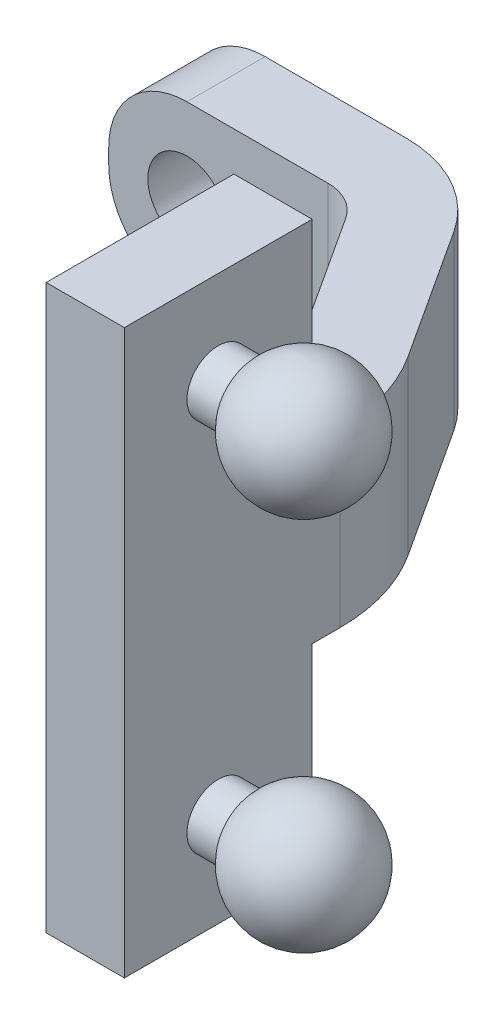
ISO-10303-21;
HEADER;
FILE_DESCRIPTION(('STEP AP214'),'2;1');
FILE_NAME('part.step','',(''),(''),'','','');
FILE_SCHEMA(('AUTOMOTIVE_DESIGN { 1 0 10303 214 1 1 1 1 }'));
ENDSEC;
DATA;
#1=APPLICATION_CONTEXT('core data for automotive mechanical design processes');
#2=APPLICATION_PROTOCOL_DEFINITION('international standard','automotive_design',2000,#1);
#3=PRODUCT_CONTEXT('',#1,'mechanical');
#4=PRODUCT('Part','Part','',(#3));
#5=PRODUCT_RELATED_PRODUCT_CATEGORY('part','',(#4));
#6=PRODUCT_DEFINITION_FORMATION('','',#4);
#7=PRODUCT_DEFINITION_CONTEXT('part definition',#1,'design');
#8=PRODUCT_DEFINITION('design','',#6,#7);
#9=PRODUCT_DEFINITION_SHAPE('','',#8);
#10=(LENGTH_UNIT() NAMED_UNIT(*) SI_UNIT(.MILLI.,.METRE.));
#11=(NAMED_UNIT(*) PLANE_ANGLE_UNIT() SI_UNIT($,.RADIAN.));
#12=(NAMED_UNIT(*) SI_UNIT($,.STERADIAN.) SOLID_ANGLE_UNIT());
#13=UNCERTAINTY_MEASURE_WITH_UNIT(LENGTH_MEASURE(1.E-05),#10,'distance_accuracy_value','');
#14=(GEOMETRIC_REPRESENTATION_CONTEXT(3) GLOBAL_UNCERTAINTY_ASSIGNED_CONTEXT((#13)) GLOBAL_UNIT_ASSIGNED_CONTEXT((#10,
#11,#12)) REPRESENTATION_CONTEXT('',''));
#15=CARTESIAN_POINT('',(0.,0.,0.));
#16=DIRECTION('',(0.,0.,1.));
#17=DIRECTION('',(1.,0.,0.));
#18=AXIS2_PLACEMENT_3D('',#15,#16,#17);
#19=CARTESIAN_POINT('',(0.,2.75,0.));
#20=DIRECTION('',(1.,0.,0.));
#21=DIRECTION('',(0.,0.,-1.));
#22=AXIS2_PLACEMENT_3D('',#19,#20,#21);
#23=PLANE('',#22);
#24=DIRECTION('',(0.,-1.,0.));
#25=VECTOR('',#24,1.);
#26=CARTESIAN_POINT('',(0.,2.75,0.));
#27=LINE('',#26,#25);
#28=CARTESIAN_POINT('',(0.,0.25,0.));
#29=VERTEX_POINT('',#28);
#30=CARTESIAN_POINT('',(0.,-0.25,0.));
#31=VERTEX_POINT('',#30);
#32=EDGE_CURVE('E245',#29,#31,#27,.T.);
#33=ORIENTED_EDGE('',*,*,#32,.T.);
#34=DIRECTION('',(0.,0.,1.));
#35=VECTOR('',#34,1.);
#36=CARTESIAN_POINT('',(0.,-0.25,2.5));
#37=LINE('',#36,#35);
#38=CARTESIAN_POINT('',(0.,-0.25,2.5));
#39=VERTEX_POINT('',#38);
#40=EDGE_CURVE('E296',#31,#39,#37,.T.);
#41=ORIENTED_EDGE('',*,*,#40,.T.);
#42=DIRECTION('',(0.,-1.,0.));
#43=VECTOR('',#42,1.);
#44=CARTESIAN_POINT('',(0.,2.75,2.5));
#45=LINE('',#44,#43);
#46=CARTESIAN_POINT('',(0.,0.25,2.5));
#47=VERTEX_POINT('',#46);
#48=EDGE_CURVE('E291',#47,#39,#45,.T.);
#49=ORIENTED_EDGE('',*,*,#48,.F.);
#50=DIRECTION('',(0.,0.,1.));
#51=VECTOR('',#50,1.);
#52=CARTESIAN_POINT('',(0.,0.25,0.));
#53=LINE('',#52,#51);
#54=EDGE_CURVE('E294',#47,#29,#53,.F.);
#55=ORIENTED_EDGE('',*,*,#54,.T.);
#56=EDGE_LOOP('',(#33,#41,#49,#55));
#57=FACE_BOUND('',#56,.T.);
#58=ADVANCED_FACE('F41',(#57),#23,.F.);
#59=CARTESIAN_POINT('',(0.,2.75,2.5));
#60=DIRECTION('',(0.,0.,-1.));
#61=DIRECTION('',(-1.,0.,0.));
#62=AXIS2_PLACEMENT_3D('',#59,#60,#61);
#63=PLANE('',#62);
#64=CARTESIAN_POINT('',(2.5,0.,2.5));
#65=DIRECTION('',(0.,0.,-1.));
#66=DIRECTION('',(-1.,0.,0.));
#67=AXIS2_PLACEMENT_3D('',#64,#65,#66);
#68=CIRCLE('',#67,1.25);
#69=CARTESIAN_POINT('',(1.25,0.,2.5));
#70=VERTEX_POINT('',#69);
#71=EDGE_CURVE('E220',#70,#70,#68,.T.);
#72=ORIENTED_EDGE('',*,*,#71,.T.);
#73=EDGE_LOOP('',(#72));
#74=FACE_BOUND('',#73,.T.);
#75=ORIENTED_EDGE('',*,*,#48,.T.);
#76=CARTESIAN_POINT('',(2.5,-0.25,2.5));
#77=DIRECTION('',(0.,0.,-1.));
#78=DIRECTION('',(-1.,0.,0.));
#79=AXIS2_PLACEMENT_3D('',#76,#77,#78);
#80=CIRCLE('',#79,2.5);
#81=CARTESIAN_POINT('',(2.5,-2.75,2.5));
#82=VERTEX_POINT('',#81);
#83=EDGE_CURVE('E301',#39,#82,#80,.F.);
#84=ORIENTED_EDGE('',*,*,#83,.T.);
#85=DIRECTION('',(1.,0.,0.));
#86=VECTOR('',#85,1.);
#87=CARTESIAN_POINT('',(0.,-2.75,2.5));
#88=LINE('',#87,#86);
#89=CARTESIAN_POINT('',(7.,-2.75,2.5));
#90=VERTEX_POINT('',#89);
#91=EDGE_CURVE('E223',#82,#90,#88,.T.);
#92=ORIENTED_EDGE('',*,*,#91,.T.);
#93=DIRECTION('',(0.,-1.,0.));
#94=VECTOR('',#93,1.);
#95=CARTESIAN_POINT('',(7.,2.75,2.5));
#96=LINE('',#95,#94);
#97=CARTESIAN_POINT('',(7.,2.75,2.5));
#98=VERTEX_POINT('',#97);
#99=EDGE_CURVE('E288',#98,#90,#96,.T.);
#100=ORIENTED_EDGE('',*,*,#99,.F.);
#101=DIRECTION('',(1.,0.,0.));
#102=VECTOR('',#101,1.);
#103=CARTESIAN_POINT('',(0.,2.75,2.5));
#104=LINE('',#103,#102);
#105=CARTESIAN_POINT('',(2.5,2.75,2.5));
#106=VERTEX_POINT('',#105);
#107=EDGE_CURVE('E224',#106,#98,#104,.T.);
#108=ORIENTED_EDGE('',*,*,#107,.F.);
#109=CARTESIAN_POINT('',(2.5,0.25,2.5));
#110=DIRECTION('',(0.,0.,-1.));
#111=DIRECTION('',(-1.,0.,0.));
#112=AXIS2_PLACEMENT_3D('',#109,#110,#111);
#113=CIRCLE('',#112,2.5);
#114=EDGE_CURVE('E299',#106,#47,#113,.F.);
#115=ORIENTED_EDGE('',*,*,#114,.T.);
#116=EDGE_LOOP('',(#75,#84,#92,#100,#108,#115));
#117=FACE_BOUND('',#116,.T.);
#118=ADVANCED_FACE('F384',(#74,#117),#63,.F.);
#119=CARTESIAN_POINT('',(7.,2.75,4.));
#120=DIRECTION('',(0.,-1.,0.));
#121=DIRECTION('',(0.,0.,-1.));
#122=AXIS2_PLACEMENT_3D('',#119,#120,#121);
#123=CYLINDRICAL_SURFACE('',#122,1.5);
#124=CARTESIAN_POINT('',(7.,-2.75,4.));
#125=DIRECTION('',(0.,-1.,0.));
#126=DIRECTION('',(0.,0.,-1.));
#127=AXIS2_PLACEMENT_3D('',#124,#125,#126);
#128=CIRCLE('',#127,1.5);
#129=CARTESIAN_POINT('',(8.25754577081105,-2.75,3.18233342106012));
#130=VERTEX_POINT('',#129);
#131=EDGE_CURVE('E247',#90,#130,#128,.T.);
#132=ORIENTED_EDGE('',*,*,#131,.T.);
#133=DIRECTION('',(0.,-1.,0.));
#134=VECTOR('',#133,1.);
#135=CARTESIAN_POINT('',(8.25754577081105,2.75,3.18233342106012));
#136=LINE('',#135,#134);
#137=CARTESIAN_POINT('',(8.25754577081105,2.75,3.18233342106012));
#138=VERTEX_POINT('',#137);
#139=EDGE_CURVE('E285',#138,#130,#136,.T.);
#140=ORIENTED_EDGE('',*,*,#139,.F.);
#141=CARTESIAN_POINT('',(7.,2.75,4.));
#142=DIRECTION('',(0.,-1.,0.));
#143=DIRECTION('',(0.,0.,-1.));
#144=AXIS2_PLACEMENT_3D('',#141,#142,#143);
#145=CIRCLE('',#144,1.5);
#146=EDGE_CURVE('E226',#98,#138,#145,.T.);
#147=ORIENTED_EDGE('',*,*,#146,.F.);
#148=ORIENTED_EDGE('',*,*,#99,.T.);
#149=EDGE_LOOP('',(#132,#140,#147,#148));
#150=FACE_BOUND('',#149,.T.);
#151=ADVANCED_FACE('F347',(#150),#123,.F.);
#152=CARTESIAN_POINT('',(8.25754577081105,2.75,3.18233342106012));
#153=DIRECTION('',(0.838363847207363,0.,-0.54511105262659));
#154=DIRECTION('',(-0.54511105262659,0.,-0.838363847207363));
#155=AXIS2_PLACEMENT_3D('',#152,#153,#154);
#156=PLANE('',#155);
#157=DIRECTION('',(0.54511105262659,0.,0.838363847207363));
#158=VECTOR('',#157,1.);
#159=CARTESIAN_POINT('',(8.25754577081105,-2.75,3.18233342106012));
#160=LINE('',#159,#158);
#161=CARTESIAN_POINT('',(10.9902966016318,-2.75,7.38521921643481));
#162=VERTEX_POINT('',#161);
#163=EDGE_CURVE('E249',#130,#162,#160,.T.);
#164=ORIENTED_EDGE('',*,*,#163,.T.);
#165=DIRECTION('',(0.,-1.,0.));
#166=VECTOR('',#165,1.);
#167=CARTESIAN_POINT('',(10.9902966016318,2.75,7.38521921643481));
#168=LINE('',#167,#166);
#169=CARTESIAN_POINT('',(10.9902966016318,2.75,7.38521921643481));
#170=VERTEX_POINT('',#169);
#171=EDGE_CURVE('E282',#170,#162,#168,.T.);
#172=ORIENTED_EDGE('',*,*,#171,.F.);
#173=DIRECTION('',(0.54511105262659,0.,0.838363847207363));
#174=VECTOR('',#173,1.);
#175=CARTESIAN_POINT('',(8.25754577081105,2.75,3.18233342106012));
#176=LINE('',#175,#174);
#177=EDGE_CURVE('E229',#138,#170,#176,.T.);
#178=ORIENTED_EDGE('',*,*,#177,.F.);
#179=ORIENTED_EDGE('',*,*,#139,.T.);
#180=EDGE_LOOP('',(#164,#172,#178,#179));
#181=FACE_BOUND('',#180,.T.);
#182=ADVANCED_FACE('F343',(#181),#156,.F.);
#183=CARTESIAN_POINT('',(8.34660028365028,2.75,9.10417225516659));
#184=DIRECTION('',(0.,-1.,0.));
#185=DIRECTION('',(0.,0.,-1.));
#186=AXIS2_PLACEMENT_3D('',#183,#184,#185);
#187=CYLINDRICAL_SURFACE('',#186,3.15339971634972);
#188=CARTESIAN_POINT('',(8.34660028365028,-2.75,9.10417225516659));
#189=DIRECTION('',(0.,-1.,0.));
#190=DIRECTION('',(0.,0.,1.));
#191=AXIS2_PLACEMENT_3D('',#188,#189,#190);
#192=CIRCLE('',#191,3.15339971634972);
#193=CARTESIAN_POINT('',(11.5,-2.75,9.10417225516659));
#194=VERTEX_POINT('',#193);
#195=EDGE_CURVE('E251',#162,#194,#192,.T.);
#196=ORIENTED_EDGE('',*,*,#195,.T.);
#197=DIRECTION('',(0.,-1.,0.));
#198=VECTOR('',#197,1.);
#199=CARTESIAN_POINT('',(11.5,2.75,9.10417225516659));
#200=LINE('',#199,#198);
#201=CARTESIAN_POINT('',(11.5,2.75,9.10417225516659));
#202=VERTEX_POINT('',#201);
#203=EDGE_CURVE('E179',#202,#194,#200,.T.);
#204=ORIENTED_EDGE('',*,*,#203,.F.);
#205=CARTESIAN_POINT('',(8.34660028365028,2.75,9.10417225516659));
#206=DIRECTION('',(0.,-1.,0.));
#207=DIRECTION('',(0.,0.,1.));
#208=AXIS2_PLACEMENT_3D('',#205,#206,#207);
#209=CIRCLE('',#208,3.15339971634972);
#210=EDGE_CURVE('E231',#170,#202,#209,.T.);
#211=ORIENTED_EDGE('',*,*,#210,.F.);
#212=ORIENTED_EDGE('',*,*,#171,.T.);
#213=EDGE_LOOP('',(#196,#204,#211,#212));
#214=FACE_BOUND('',#213,.T.);
#215=ADVANCED_FACE('F339',(#214),#187,.F.);
#216=CARTESIAN_POINT('',(11.5,2.75,9.10417225516659));
#217=DIRECTION('',(1.,0.,0.));
#218=DIRECTION('',(0.,0.,-1.));
#219=AXIS2_PLACEMENT_3D('',#216,#217,#218);
#220=PLANE('',#219);
#221=DIRECTION('',(0.,0.,1.));
#222=VECTOR('',#221,1.);
#223=CARTESIAN_POINT('',(11.5,-2.75,9.10417225516659));
#224=LINE('',#223,#222);
#225=CARTESIAN_POINT('',(11.5,-2.75,10.));
#226=VERTEX_POINT('',#225);
#227=EDGE_CURVE('E253',#194,#226,#224,.T.);
#228=ORIENTED_EDGE('',*,*,#227,.T.);
#229=DIRECTION('',(0.,-1.,0.));
#230=VECTOR('',#229,1.);
#231=CARTESIAN_POINT('',(11.5,8.99999999999999,10.));
#232=LINE('',#231,#230);
#233=CARTESIAN_POINT('',(11.5,-9.,10.));
#234=VERTEX_POINT('',#233);
#235=EDGE_CURVE('E193',#226,#234,#232,.T.);
#236=ORIENTED_EDGE('',*,*,#235,.T.);
#237=DIRECTION('',(0.,0.,1.));
#238=VECTOR('',#237,1.);
#239=CARTESIAN_POINT('',(11.5,-9.,10.));
#240=LINE('',#239,#238);
#241=CARTESIAN_POINT('',(11.5,-9.,16.));
#242=VERTEX_POINT('',#241);
#243=EDGE_CURVE('E175',#234,#242,#240,.T.);
#244=ORIENTED_EDGE('',*,*,#243,.T.);
#245=DIRECTION('',(0.,-1.,0.));
#246=VECTOR('',#245,1.);
#247=CARTESIAN_POINT('',(11.5,2.75,16.));
#248=LINE('',#247,#246);
#249=CARTESIAN_POINT('',(11.5,9.,16.));
#250=VERTEX_POINT('',#249);
#251=EDGE_CURVE('E167',#250,#242,#248,.T.);
#252=ORIENTED_EDGE('',*,*,#251,.F.);
#253=DIRECTION('',(0.,0.,-1.));
#254=VECTOR('',#253,1.);
#255=CARTESIAN_POINT('',(11.5,8.99999999999999,10.));
#256=LINE('',#255,#254);
#257=CARTESIAN_POINT('',(11.5,8.99999999999999,10.));
#258=VERTEX_POINT('',#257);
#259=EDGE_CURVE('E173',#250,#258,#256,.T.);
#260=ORIENTED_EDGE('',*,*,#259,.T.);
#261=CARTESIAN_POINT('',(11.5,2.75,10.));
#262=VERTEX_POINT('',#261);
#263=EDGE_CURVE('E196',#258,#262,#232,.T.);
#264=ORIENTED_EDGE('',*,*,#263,.T.);
#265=DIRECTION('',(0.,0.,1.));
#266=VECTOR('',#265,1.);
#267=CARTESIAN_POINT('',(11.5,2.75,9.10417225516659));
#268=LINE('',#267,#266);
#269=EDGE_CURVE('E56',#202,#262,#268,.T.);
#270=ORIENTED_EDGE('',*,*,#269,.F.);
#271=ORIENTED_EDGE('',*,*,#203,.T.);
#272=EDGE_LOOP('',(#228,#236,#244,#252,#260,#264,#270,#271));
#273=FACE_BOUND('',#272,.T.);
#274=ADVANCED_FACE('F170',(#273),#220,.F.);
#275=CARTESIAN_POINT('',(11.5,2.75,16.));
#276=DIRECTION('',(0.,0.,-1.));
#277=DIRECTION('',(-1.,0.,0.));
#278=AXIS2_PLACEMENT_3D('',#275,#276,#277);
#279=PLANE('',#278);
#280=ORIENTED_EDGE('',*,*,#251,.T.);
#281=DIRECTION('',(-1.,0.,0.));
#282=VECTOR('',#281,1.);
#283=CARTESIAN_POINT('',(32.9736659610103,-9.,16.));
#284=LINE('',#283,#282);
#285=CARTESIAN_POINT('',(14.,-9.,16.));
#286=VERTEX_POINT('',#285);
#287=EDGE_CURVE('E206',#286,#242,#284,.T.);
#288=ORIENTED_EDGE('',*,*,#287,.F.);
#289=DIRECTION('',(0.,-1.,0.));
#290=VECTOR('',#289,1.);
#291=CARTESIAN_POINT('',(14.,2.75,16.));
#292=LINE('',#291,#290);
#293=CARTESIAN_POINT('',(14.,9.,16.));
#294=VERTEX_POINT('',#293);
#295=EDGE_CURVE('E180',#294,#286,#292,.T.);
#296=ORIENTED_EDGE('',*,*,#295,.F.);
#297=DIRECTION('',(-1.,0.,0.));
#298=VECTOR('',#297,1.);
#299=CARTESIAN_POINT('',(32.9736659610103,9.,16.));
#300=LINE('',#299,#298);
#301=EDGE_CURVE('E183',#294,#250,#300,.T.);
#302=ORIENTED_EDGE('',*,*,#301,.T.);
#303=EDGE_LOOP('',(#280,#288,#296,#302));
#304=FACE_BOUND('',#303,.T.);
#305=ADVANCED_FACE('F184',(#304),#279,.F.);
#306=CARTESIAN_POINT('',(14.,2.75,9.10417225516659));
#307=DIRECTION('',(-1.,0.,0.));
#308=DIRECTION('',(0.,0.,1.));
#309=AXIS2_PLACEMENT_3D('',#306,#307,#308);
#310=PLANE('',#309);
#311=CARTESIAN_POINT('',(14.,-5.99999999999999,13.));
#312=DIRECTION('',(-1.,0.,0.));
#313=DIRECTION('',(0.,0.,-1.));
#314=AXIS2_PLACEMENT_3D('',#311,#312,#313);
#315=CIRCLE('',#314,1.);
#316=CARTESIAN_POINT('',(14.,-5.99999999999999,12.));
#317=VERTEX_POINT('',#316);
#318=EDGE_CURVE('E199',#317,#317,#315,.T.);
#319=ORIENTED_EDGE('',*,*,#318,.T.);
#320=EDGE_LOOP('',(#319));
#321=FACE_BOUND('',#320,.T.);
#322=CARTESIAN_POINT('',(14.,5.99999999999999,13.));
#323=DIRECTION('',(-1.,0.,0.));
#324=DIRECTION('',(0.,0.,1.));
#325=AXIS2_PLACEMENT_3D('',#322,#323,#324);
#326=CIRCLE('',#325,1.);
#327=CARTESIAN_POINT('',(14.,5.99999999999999,14.));
#328=VERTEX_POINT('',#327);
#329=EDGE_CURVE('E11',#328,#328,#326,.F.);
#330=ORIENTED_EDGE('',*,*,#329,.F.);
#331=EDGE_LOOP('',(#330));
#332=FACE_BOUND('',#331,.T.);
#333=DIRECTION('',(0.,0.,-1.));
#334=VECTOR('',#333,1.);
#335=CARTESIAN_POINT('',(14.,2.75,9.10417225516659));
#336=LINE('',#335,#334);
#337=CARTESIAN_POINT('',(14.,2.75,10.));
#338=VERTEX_POINT('',#337);
#339=CARTESIAN_POINT('',(14.,2.75,9.10417225516659));
#340=VERTEX_POINT('',#339);
#341=EDGE_CURVE('E234',#338,#340,#336,.T.);
#342=ORIENTED_EDGE('',*,*,#341,.F.);
#343=DIRECTION('',(0.,1.,0.));
#344=VECTOR('',#343,1.);
#345=CARTESIAN_POINT('',(14.,8.99999999999999,10.));
#346=LINE('',#345,#344);
#347=CARTESIAN_POINT('',(14.,8.99999999999999,10.));
#348=VERTEX_POINT('',#347);
#349=EDGE_CURVE('E208',#338,#348,#346,.T.);
#350=ORIENTED_EDGE('',*,*,#349,.T.);
#351=DIRECTION('',(0.,0.,1.));
#352=VECTOR('',#351,1.);
#353=CARTESIAN_POINT('',(14.,8.99999999999999,9.99999999999999));
#354=LINE('',#353,#352);
#355=EDGE_CURVE('E213',#348,#294,#354,.T.);
#356=ORIENTED_EDGE('',*,*,#355,.T.);
#357=ORIENTED_EDGE('',*,*,#295,.T.);
#358=DIRECTION('',(0.,0.,-1.));
#359=VECTOR('',#358,1.);
#360=CARTESIAN_POINT('',(14.,-9.,9.99999999999999));
#361=LINE('',#360,#359);
#362=CARTESIAN_POINT('',(14.,-9.,10.));
#363=VERTEX_POINT('',#362);
#364=EDGE_CURVE('E202',#286,#363,#361,.T.);
#365=ORIENTED_EDGE('',*,*,#364,.T.);
#366=CARTESIAN_POINT('',(14.,-2.75,9.99999999999999));
#367=VERTEX_POINT('',#366);
#368=EDGE_CURVE('E64',#363,#367,#346,.T.);
#369=ORIENTED_EDGE('',*,*,#368,.T.);
#370=DIRECTION('',(0.,0.,-1.));
#371=VECTOR('',#370,1.);
#372=CARTESIAN_POINT('',(14.,-2.75,9.10417225516659));
#373=LINE('',#372,#371);
#374=CARTESIAN_POINT('',(14.,-2.75,9.10417225516659));
#375=VERTEX_POINT('',#374);
#376=EDGE_CURVE('E255',#367,#375,#373,.T.);
#377=ORIENTED_EDGE('',*,*,#376,.T.);
#378=DIRECTION('',(0.,-1.,0.));
#379=VECTOR('',#378,1.);
#380=CARTESIAN_POINT('',(14.,2.75,9.10417225516659));
#381=LINE('',#380,#379);
#382=EDGE_CURVE('E276',#340,#375,#381,.T.);
#383=ORIENTED_EDGE('',*,*,#382,.F.);
#384=EDGE_LOOP('',(#342,#350,#356,#357,#365,#369,#377,#383));
#385=FACE_BOUND('',#384,.T.);
#386=ADVANCED_FACE('F322',(#321,#332,#385),#310,.F.);
#387=CARTESIAN_POINT('',(8.34660028365028,2.75,9.10417225516659));
#388=DIRECTION('',(0.,-1.,0.));
#389=DIRECTION('',(0.,0.,-1.));
#390=AXIS2_PLACEMENT_3D('',#387,#388,#389);
#391=CYLINDRICAL_SURFACE('',#390,5.65339971634972);
#392=CARTESIAN_POINT('',(8.34660028365028,-2.75,9.10417225516659));
#393=DIRECTION('',(0.,1.,0.));
#394=DIRECTION('',(0.,0.,-1.));
#395=AXIS2_PLACEMENT_3D('',#392,#393,#394);
#396=CIRCLE('',#395,5.65339971634972);
#397=CARTESIAN_POINT('',(13.0862062196502,-2.75,6.02244158486833));
#398=VERTEX_POINT('',#397);
#399=EDGE_CURVE('E257',#375,#398,#396,.T.);
#400=ORIENTED_EDGE('',*,*,#399,.T.);
#401=DIRECTION('',(0.,-1.,0.));
#402=VECTOR('',#401,1.);
#403=CARTESIAN_POINT('',(13.0862062196502,2.75,6.02244158486833));
#404=LINE('',#403,#402);
#405=CARTESIAN_POINT('',(13.0862062196502,2.75,6.02244158486833));
#406=VERTEX_POINT('',#405);
#407=EDGE_CURVE('E273',#406,#398,#404,.T.);
#408=ORIENTED_EDGE('',*,*,#407,.F.);
#409=CARTESIAN_POINT('',(8.34660028365028,2.75,9.10417225516659));
#410=DIRECTION('',(0.,1.,0.));
#411=DIRECTION('',(0.,0.,-1.));
#412=AXIS2_PLACEMENT_3D('',#409,#410,#411);
#413=CIRCLE('',#412,5.65339971634972);
#414=EDGE_CURVE('E236',#340,#406,#413,.T.);
#415=ORIENTED_EDGE('',*,*,#414,.F.);
#416=ORIENTED_EDGE('',*,*,#382,.T.);
#417=EDGE_LOOP('',(#400,#408,#415,#416));
#418=FACE_BOUND('',#417,.T.);
#419=ADVANCED_FACE('F325',(#418),#391,.T.);
#420=CARTESIAN_POINT('',(10.3534553888295,2.75,1.81955578949364));
#421=DIRECTION('',(-0.838363847207363,0.,0.54511105262659));
#422=DIRECTION('',(0.54511105262659,0.,0.838363847207363));
#423=AXIS2_PLACEMENT_3D('',#420,#421,#422);
#424=PLANE('',#423);
#425=DIRECTION('',(-0.54511105262659,0.,-0.838363847207363));
#426=VECTOR('',#425,1.);
#427=CARTESIAN_POINT('',(10.3534553888295,-2.75,1.81955578949364));
#428=LINE('',#427,#426);
#429=CARTESIAN_POINT('',(10.3534553888295,-2.75,1.81955578949364));
#430=VERTEX_POINT('',#429);
#431=EDGE_CURVE('E259',#398,#430,#428,.T.);
#432=ORIENTED_EDGE('',*,*,#431,.T.);
#433=DIRECTION('',(0.,-1.,0.));
#434=VECTOR('',#433,1.);
#435=CARTESIAN_POINT('',(10.3534553888295,2.75,1.81955578949364));
#436=LINE('',#435,#434);
#437=CARTESIAN_POINT('',(10.3534553888295,2.75,1.81955578949364));
#438=VERTEX_POINT('',#437);
#439=EDGE_CURVE('E270',#438,#430,#436,.T.);
#440=ORIENTED_EDGE('',*,*,#439,.F.);
#441=DIRECTION('',(-0.54511105262659,0.,-0.838363847207363));
#442=VECTOR('',#441,1.);
#443=CARTESIAN_POINT('',(10.3534553888295,2.75,1.81955578949364));
#444=LINE('',#443,#442);
#445=EDGE_CURVE('E238',#406,#438,#444,.T.);
#446=ORIENTED_EDGE('',*,*,#445,.F.);
#447=ORIENTED_EDGE('',*,*,#407,.T.);
#448=EDGE_LOOP('',(#432,#440,#446,#447));
#449=FACE_BOUND('',#448,.T.);
#450=ADVANCED_FACE('F374',(#449),#424,.F.);
#451=CARTESIAN_POINT('',(7.,2.75,4.));
#452=DIRECTION('',(0.,-1.,0.));
#453=DIRECTION('',(0.,0.,-1.));
#454=AXIS2_PLACEMENT_3D('',#451,#452,#453);
#455=CYLINDRICAL_SURFACE('',#454,4.);
#456=CARTESIAN_POINT('',(7.,-2.75,4.));
#457=DIRECTION('',(0.,1.,0.));
#458=DIRECTION('',(0.,0.,-1.));
#459=AXIS2_PLACEMENT_3D('',#456,#457,#458);
#460=CIRCLE('',#459,4.);
#461=CARTESIAN_POINT('',(7.,-2.75,0.));
#462=VERTEX_POINT('',#461);
#463=EDGE_CURVE('E261',#430,#462,#460,.T.);
#464=ORIENTED_EDGE('',*,*,#463,.T.);
#465=DIRECTION('',(0.,-1.,0.));
#466=VECTOR('',#465,1.);
#467=CARTESIAN_POINT('',(7.,2.75,0.));
#468=LINE('',#467,#466);
#469=CARTESIAN_POINT('',(7.,2.75,0.));
#470=VERTEX_POINT('',#469);
#471=EDGE_CURVE('E267',#470,#462,#468,.T.);
#472=ORIENTED_EDGE('',*,*,#471,.F.);
#473=CARTESIAN_POINT('',(7.,2.75,4.));
#474=DIRECTION('',(0.,1.,0.));
#475=DIRECTION('',(0.,0.,-1.));
#476=AXIS2_PLACEMENT_3D('',#473,#474,#475);
#477=CIRCLE('',#476,4.);
#478=EDGE_CURVE('E240',#438,#470,#477,.T.);
#479=ORIENTED_EDGE('',*,*,#478,.F.);
#480=ORIENTED_EDGE('',*,*,#439,.T.);
#481=EDGE_LOOP('',(#464,#472,#479,#480));
#482=FACE_BOUND('',#481,.T.);
#483=ADVANCED_FACE('F371',(#482),#455,.T.);
#484=CARTESIAN_POINT('',(0.,2.75,0.));
#485=DIRECTION('',(0.,0.,1.));
#486=DIRECTION('',(1.,0.,0.));
#487=AXIS2_PLACEMENT_3D('',#484,#485,#486);
#488=PLANE('',#487);
#489=CARTESIAN_POINT('',(2.5,0.,0.));
#490=DIRECTION('',(0.,0.,-1.));
#491=DIRECTION('',(-1.,0.,0.));
#492=AXIS2_PLACEMENT_3D('',#489,#490,#491);
#493=CIRCLE('',#492,1.25);
#494=CARTESIAN_POINT('',(1.25,0.,0.));
#495=VERTEX_POINT('',#494);
#496=EDGE_CURVE('E217',#495,#495,#493,.T.);
#497=ORIENTED_EDGE('',*,*,#496,.F.);
#498=EDGE_LOOP('',(#497));
#499=FACE_BOUND('',#498,.T.);
#500=DIRECTION('',(-1.,0.,0.));
#501=VECTOR('',#500,1.);
#502=CARTESIAN_POINT('',(0.,-2.75,0.));
#503=LINE('',#502,#501);
#504=CARTESIAN_POINT('',(2.5,-2.75,0.));
#505=VERTEX_POINT('',#504);
#506=EDGE_CURVE('E227',#462,#505,#503,.T.);
#507=ORIENTED_EDGE('',*,*,#506,.T.);
#508=CARTESIAN_POINT('',(2.5,-0.25,0.));
#509=DIRECTION('',(0.,0.,1.));
#510=DIRECTION('',(1.,0.,0.));
#511=AXIS2_PLACEMENT_3D('',#508,#509,#510);
#512=CIRCLE('',#511,2.5);
#513=EDGE_CURVE('E307',#505,#31,#512,.F.);
#514=ORIENTED_EDGE('',*,*,#513,.T.);
#515=ORIENTED_EDGE('',*,*,#32,.F.);
#516=CARTESIAN_POINT('',(2.5,0.25,0.));
#517=DIRECTION('',(0.,0.,1.));
#518=DIRECTION('',(1.,0.,0.));
#519=AXIS2_PLACEMENT_3D('',#516,#517,#518);
#520=CIRCLE('',#519,2.5);
#521=CARTESIAN_POINT('',(2.5,2.75,0.));
#522=VERTEX_POINT('',#521);
#523=EDGE_CURVE('E305',#29,#522,#520,.F.);
#524=ORIENTED_EDGE('',*,*,#523,.T.);
#525=DIRECTION('',(-1.,0.,0.));
#526=VECTOR('',#525,1.);
#527=CARTESIAN_POINT('',(0.,2.75,0.));
#528=LINE('',#527,#526);
#529=EDGE_CURVE('E242',#470,#522,#528,.T.);
#530=ORIENTED_EDGE('',*,*,#529,.F.);
#531=ORIENTED_EDGE('',*,*,#471,.T.);
#532=EDGE_LOOP('',(#507,#514,#515,#524,#530,#531));
#533=FACE_BOUND('',#532,.T.);
#534=ADVANCED_FACE('F359',(#499,#533),#488,.F.);
#535=CARTESIAN_POINT('',(7.,2.75,4.));
#536=DIRECTION('',(0.,-1.,0.));
#537=DIRECTION('',(0.,0.,-1.));
#538=AXIS2_PLACEMENT_3D('',#535,#536,#537);
#539=PLANE('',#538);
#540=ORIENTED_EDGE('',*,*,#269,.T.);
#541=DIRECTION('',(1.,0.,0.));
#542=VECTOR('',#541,1.);
#543=CARTESIAN_POINT('',(7.,2.75,10.));
#544=LINE('',#543,#542);
#545=EDGE_CURVE('E215',#262,#338,#544,.T.);
#546=ORIENTED_EDGE('',*,*,#545,.T.);
#547=ORIENTED_EDGE('',*,*,#341,.T.);
#548=ORIENTED_EDGE('',*,*,#414,.T.);
#549=ORIENTED_EDGE('',*,*,#445,.T.);
#550=ORIENTED_EDGE('',*,*,#478,.T.);
#551=ORIENTED_EDGE('',*,*,#529,.T.);
#552=DIRECTION('',(0.,0.,1.));
#553=VECTOR('',#552,1.);
#554=CARTESIAN_POINT('',(2.5,2.75,4.));
#555=LINE('',#554,#553);
#556=EDGE_CURVE('E309',#522,#106,#555,.T.);
#557=ORIENTED_EDGE('',*,*,#556,.T.);
#558=ORIENTED_EDGE('',*,*,#107,.T.);
#559=ORIENTED_EDGE('',*,*,#146,.T.);
#560=ORIENTED_EDGE('',*,*,#177,.T.);
#561=ORIENTED_EDGE('',*,*,#210,.T.);
#562=EDGE_LOOP('',(#540,#546,#547,#548,#549,#550,#551,#557,#558,#559,#560,#561));
#563=FACE_BOUND('',#562,.T.);
#564=ADVANCED_FACE('F328',(#563),#539,.F.);
#565=CARTESIAN_POINT('',(7.,-2.75,4.));
#566=DIRECTION('',(0.,-1.,0.));
#567=DIRECTION('',(0.,0.,-1.));
#568=AXIS2_PLACEMENT_3D('',#565,#566,#567);
#569=PLANE('',#568);
#570=DIRECTION('',(1.,0.,0.));
#571=VECTOR('',#570,1.);
#572=CARTESIAN_POINT('',(7.,-2.75,10.));
#573=LINE('',#572,#571);
#574=EDGE_CURVE('E49',#226,#367,#573,.T.);
#575=ORIENTED_EDGE('',*,*,#574,.F.);
#576=ORIENTED_EDGE('',*,*,#227,.F.);
#577=ORIENTED_EDGE('',*,*,#195,.F.);
#578=ORIENTED_EDGE('',*,*,#163,.F.);
#579=ORIENTED_EDGE('',*,*,#131,.F.);
#580=ORIENTED_EDGE('',*,*,#91,.F.);
#581=DIRECTION('',(0.,0.,1.));
#582=VECTOR('',#581,1.);
#583=CARTESIAN_POINT('',(2.5,-2.75,0.));
#584=LINE('',#583,#582);
#585=EDGE_CURVE('E303',#82,#505,#584,.F.);
#586=ORIENTED_EDGE('',*,*,#585,.T.);
#587=ORIENTED_EDGE('',*,*,#506,.F.);
#588=ORIENTED_EDGE('',*,*,#463,.F.);
#589=ORIENTED_EDGE('',*,*,#431,.F.);
#590=ORIENTED_EDGE('',*,*,#399,.F.);
#591=ORIENTED_EDGE('',*,*,#376,.F.);
#592=EDGE_LOOP('',(#575,#576,#577,#578,#579,#580,#586,#587,#588,#589,#590,#591));
#593=FACE_BOUND('',#592,.T.);
#594=ADVANCED_FACE('F319',(#593),#569,.T.);
#595=CARTESIAN_POINT('',(2.5,0.,10.));
#596=DIRECTION('',(0.,0.,-1.));
#597=DIRECTION('',(-1.,0.,0.));
#598=AXIS2_PLACEMENT_3D('',#595,#596,#597);
#599=CYLINDRICAL_SURFACE('',#598,1.25);
#600=ORIENTED_EDGE('',*,*,#496,.T.);
#601=EDGE_LOOP('',(#600));
#602=FACE_BOUND('',#601,.T.);
#603=ORIENTED_EDGE('',*,*,#71,.F.);
#604=EDGE_LOOP('',(#603));
#605=FACE_BOUND('',#604,.T.);
#606=ADVANCED_FACE('F394',(#602,#605),#599,.F.);
#607=CARTESIAN_POINT('',(2.5,-0.25,0.));
#608=DIRECTION('',(0.,0.,-1.));
#609=DIRECTION('',(-1.,0.,0.));
#610=AXIS2_PLACEMENT_3D('',#607,#608,#609);
#611=CYLINDRICAL_SURFACE('',#610,2.5);
#612=ORIENTED_EDGE('',*,*,#513,.F.);
#613=ORIENTED_EDGE('',*,*,#585,.F.);
#614=ORIENTED_EDGE('',*,*,#83,.F.);
#615=ORIENTED_EDGE('',*,*,#40,.F.);
#616=EDGE_LOOP('',(#612,#613,#614,#615));
#617=FACE_BOUND('',#616,.T.);
#618=ADVANCED_FACE('F355',(#617),#611,.T.);
#619=CARTESIAN_POINT('',(2.5,0.25,4.));
#620=DIRECTION('',(0.,0.,1.));
#621=DIRECTION('',(1.,0.,0.));
#622=AXIS2_PLACEMENT_3D('',#619,#620,#621);
#623=CYLINDRICAL_SURFACE('',#622,2.5);
#624=ORIENTED_EDGE('',*,*,#523,.F.);
#625=ORIENTED_EDGE('',*,*,#54,.F.);
#626=ORIENTED_EDGE('',*,*,#114,.F.);
#627=ORIENTED_EDGE('',*,*,#556,.F.);
#628=EDGE_LOOP('',(#624,#625,#626,#627));
#629=FACE_BOUND('',#628,.T.);
#630=ADVANCED_FACE('F43',(#629),#623,.T.);
#631=CARTESIAN_POINT('',(32.9736659610103,-9.,9.99999999999999));
#632=DIRECTION('',(0.,-1.,0.));
#633=DIRECTION('',(0.,0.,-1.));
#634=AXIS2_PLACEMENT_3D('',#631,#632,#633);
#635=PLANE('',#634);
#636=ORIENTED_EDGE('',*,*,#364,.F.);
#637=ORIENTED_EDGE('',*,*,#287,.T.);
#638=ORIENTED_EDGE('',*,*,#243,.F.);
#639=DIRECTION('',(-1.,0.,0.));
#640=VECTOR('',#639,1.);
#641=CARTESIAN_POINT('',(32.9736659610103,-9.,9.99999999999999));
#642=LINE('',#641,#640);
#643=EDGE_CURVE('E209',#363,#234,#642,.T.);
#644=ORIENTED_EDGE('',*,*,#643,.F.);
#645=EDGE_LOOP('',(#636,#637,#638,#644));
#646=FACE_BOUND('',#645,.T.);
#647=ADVANCED_FACE('F399',(#646),#635,.T.);
#648=CARTESIAN_POINT('',(32.9736659610103,8.99999999999999,9.99999999999999));
#649=DIRECTION('',(0.,0.,-1.));
#650=DIRECTION('',(-1.,0.,0.));
#651=AXIS2_PLACEMENT_3D('',#648,#649,#650);
#652=PLANE('',#651);
#653=ORIENTED_EDGE('',*,*,#235,.F.);
#654=ORIENTED_EDGE('',*,*,#574,.T.);
#655=ORIENTED_EDGE('',*,*,#368,.F.);
#656=ORIENTED_EDGE('',*,*,#643,.T.);
#657=EDGE_LOOP('',(#653,#654,#655,#656));
#658=FACE_BOUND('',#657,.T.);
#659=ADVANCED_FACE('F314',(#658),#652,.T.);
#660=ORIENTED_EDGE('',*,*,#545,.F.);
#661=ORIENTED_EDGE('',*,*,#263,.F.);
#662=DIRECTION('',(-1.,0.,0.));
#663=VECTOR('',#662,1.);
#664=CARTESIAN_POINT('',(32.9736659610103,8.99999999999999,9.99999999999999));
#665=LINE('',#664,#663);
#666=EDGE_CURVE('E188',#348,#258,#665,.T.);
#667=ORIENTED_EDGE('',*,*,#666,.F.);
#668=ORIENTED_EDGE('',*,*,#349,.F.);
#669=EDGE_LOOP('',(#660,#661,#667,#668));
#670=FACE_BOUND('',#669,.T.);
#671=ADVANCED_FACE('F332',(#670),#652,.T.);
#672=CARTESIAN_POINT('',(32.9736659610103,8.99999999999999,9.99999999999999));
#673=DIRECTION('',(0.,1.,0.));
#674=DIRECTION('',(0.,0.,1.));
#675=AXIS2_PLACEMENT_3D('',#672,#673,#674);
#676=PLANE('',#675);
#677=ORIENTED_EDGE('',*,*,#355,.F.);
#678=ORIENTED_EDGE('',*,*,#666,.T.);
#679=ORIENTED_EDGE('',*,*,#259,.F.);
#680=ORIENTED_EDGE('',*,*,#301,.F.);
#681=EDGE_LOOP('',(#677,#678,#679,#680));
#682=FACE_BOUND('',#681,.T.);
#683=ADVANCED_FACE('F190',(#682),#676,.T.);
#684=CARTESIAN_POINT('',(15.,5.99999999999999,13.));
#685=DIRECTION('',(-1.,0.,0.));
#686=DIRECTION('',(0.,0.,1.));
#687=AXIS2_PLACEMENT_3D('',#684,#685,#686);
#688=CYLINDRICAL_SURFACE('',#687,1.);
#689=CARTESIAN_POINT('',(15.,5.99999999999999,13.));
#690=DIRECTION('',(1.,0.,0.));
#691=DIRECTION('',(0.,0.,-1.));
#692=AXIS2_PLACEMENT_3D('',#689,#690,#691);
#693=CIRCLE('',#692,1.);
#694=CARTESIAN_POINT('',(15.,5.99999999999999,12.));
#695=VERTEX_POINT('',#694);
#696=EDGE_CURVE('E194',#695,#695,#693,.T.);
#697=ORIENTED_EDGE('',*,*,#696,.F.);
#698=EDGE_LOOP('',(#697));
#699=FACE_BOUND('',#698,.T.);
#700=ORIENTED_EDGE('',*,*,#329,.T.);
#701=EDGE_LOOP('',(#700));
#702=FACE_BOUND('',#701,.T.);
#703=ADVANCED_FACE('F547',(#699,#702),#688,.T.);
#704=CARTESIAN_POINT('',(16.7320508075689,5.99999999999999,13.));
#705=DIRECTION('',(-1.,0.,0.));
#706=DIRECTION('',(0.,1.,0.));
#707=AXIS2_PLACEMENT_3D('',#704,#705,#706);
#708=SPHERICAL_SURFACE('',#707,2.);
#709=ORIENTED_EDGE('',*,*,#696,.T.);
#710=EDGE_LOOP('',(#709));
#711=FACE_BOUND('',#710,.T.);
#712=ADVANCED_FACE('F554',(#711),#708,.T.);
#713=CARTESIAN_POINT('',(15.,-5.99999999999999,13.));
#714=DIRECTION('',(-1.,0.,0.));
#715=DIRECTION('',(0.,0.,1.));
#716=AXIS2_PLACEMENT_3D('',#713,#714,#715);
#717=CYLINDRICAL_SURFACE('',#716,1.);
#718=CARTESIAN_POINT('',(15.,-5.99999999999999,13.));
#719=DIRECTION('',(1.,0.,0.));
#720=DIRECTION('',(0.,0.,1.));
#721=AXIS2_PLACEMENT_3D('',#718,#719,#720);
#722=CIRCLE('',#721,1.);
#723=CARTESIAN_POINT('',(15.,-5.99999999999999,14.));
#724=VERTEX_POINT('',#723);
#725=EDGE_CURVE('E600',#724,#724,#722,.T.);
#726=ORIENTED_EDGE('',*,*,#725,.F.);
#727=EDGE_LOOP('',(#726));
#728=FACE_BOUND('',#727,.T.);
#729=ORIENTED_EDGE('',*,*,#318,.F.);
#730=EDGE_LOOP('',(#729));
#731=FACE_BOUND('',#730,.T.);
#732=ADVANCED_FACE('F563',(#728,#731),#717,.T.);
#733=CARTESIAN_POINT('',(16.7320508075689,-5.99999999999999,13.));
#734=DIRECTION('',(-1.,0.,0.));
#735=DIRECTION('',(0.,-1.,0.));
#736=AXIS2_PLACEMENT_3D('',#733,#734,#735);
#737=SPHERICAL_SURFACE('',#736,2.);
#738=ORIENTED_EDGE('',*,*,#725,.T.);
#739=EDGE_LOOP('',(#738));
#740=FACE_BOUND('',#739,.T.);
#741=ADVANCED_FACE('F572',(#740),#737,.T.);
#742=CLOSED_SHELL('',(#58,#118,#151,#182,#215,#274,#305,#386,#419,#450,#483,#534,#564,#594,#606,
#618,#630,#647,#659,#671,#683,#703,#712,#732,#741));
#743=MANIFOLD_SOLID_BREP('B2',#742);
#744=ADVANCED_BREP_SHAPE_REPRESENTATION('',(#18,#743),#14);
#745=SHAPE_DEFINITION_REPRESENTATION(#9,#744);
ENDSEC;
END-ISO-10303-21;
